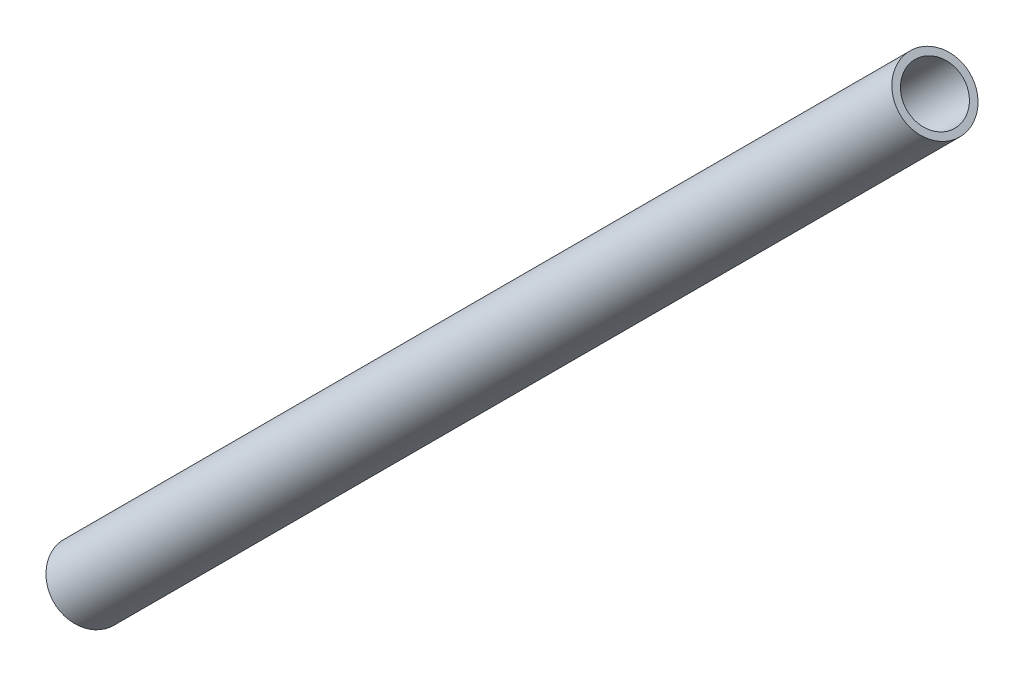
ISO-10303-21;
HEADER;
FILE_DESCRIPTION(('STEP AP214'),'2;1');
FILE_NAME('part.step','',(''),(''),'','','');
FILE_SCHEMA(('AUTOMOTIVE_DESIGN { 1 0 10303 214 1 1 1 1 }'));
ENDSEC;
DATA;
#1=APPLICATION_CONTEXT('core data for automotive mechanical design processes');
#2=APPLICATION_PROTOCOL_DEFINITION('international standard','automotive_design',2000,#1);
#3=PRODUCT_CONTEXT('',#1,'mechanical');
#4=PRODUCT('Part','Part','',(#3));
#5=PRODUCT_RELATED_PRODUCT_CATEGORY('part','',(#4));
#6=PRODUCT_DEFINITION_FORMATION('','',#4);
#7=PRODUCT_DEFINITION_CONTEXT('part definition',#1,'design');
#8=PRODUCT_DEFINITION('design','',#6,#7);
#9=PRODUCT_DEFINITION_SHAPE('','',#8);
#10=(LENGTH_UNIT() NAMED_UNIT(*) SI_UNIT(.MILLI.,.METRE.));
#11=(NAMED_UNIT(*) PLANE_ANGLE_UNIT() SI_UNIT($,.RADIAN.));
#12=(NAMED_UNIT(*) SI_UNIT($,.STERADIAN.) SOLID_ANGLE_UNIT());
#13=UNCERTAINTY_MEASURE_WITH_UNIT(LENGTH_MEASURE(1.E-05),#10,'distance_accuracy_value','');
#14=(GEOMETRIC_REPRESENTATION_CONTEXT(3) GLOBAL_UNCERTAINTY_ASSIGNED_CONTEXT((#13)) GLOBAL_UNIT_ASSIGNED_CONTEXT((#10,
#11,#12)) REPRESENTATION_CONTEXT('',''));
#15=CARTESIAN_POINT('',(0.,0.,0.));
#16=DIRECTION('',(0.,0.,1.));
#17=DIRECTION('',(1.,0.,0.));
#18=AXIS2_PLACEMENT_3D('',#15,#16,#17);
#19=CARTESIAN_POINT('',(1.84417173336933,-52.5418632261594,-9.99999999999968));
#20=DIRECTION('',(-0.707106781186544,-0.707106781186551,0.));
#21=DIRECTION('',(0.707106781186551,-0.707106781186544,0.));
#22=AXIS2_PLACEMENT_3D('',#19,#20,#21);
#23=PLANE('',#22);
#24=CARTESIAN_POINT('',(1.84417173336933,-52.5418632261594,-9.99999999999968));
#25=DIRECTION('',(-0.707106781186544,-0.707106781186551,0.));
#26=DIRECTION('',(0.707106781186551,-0.707106781186544,0.));
#27=AXIS2_PLACEMENT_3D('',#24,#25,#26);
#28=CIRCLE('',#27,5.);
#29=CARTESIAN_POINT('',(5.37970563930208,-56.0773971320922,-9.99999999999968));
#30=VERTEX_POINT('',#29);
#31=EDGE_CURVE('E10',#30,#30,#28,.T.);
#32=ORIENTED_EDGE('',*,*,#31,.T.);
#33=EDGE_LOOP('',(#32));
#34=FACE_BOUND('',#33,.T.);
#35=CARTESIAN_POINT('',(1.84417173336933,-52.5418632261594,-9.99999999999968));
#36=DIRECTION('',(-0.707106781186544,-0.707106781186551,0.));
#37=DIRECTION('',(0.707106781186551,-0.707106781186544,0.));
#38=AXIS2_PLACEMENT_3D('',#35,#36,#37);
#39=CIRCLE('',#38,3.99999999999999);
#40=CARTESIAN_POINT('',(4.67259885811553,-55.3702903509056,-9.99999999999968));
#41=VERTEX_POINT('',#40);
#42=EDGE_CURVE('E39',#41,#41,#39,.T.);
#43=ORIENTED_EDGE('',*,*,#42,.F.);
#44=EDGE_LOOP('',(#43));
#45=FACE_BOUND('',#44,.T.);
#46=ADVANCED_FACE('F28',(#34,#45),#23,.T.);
#47=CARTESIAN_POINT('',(122.052324535082,67.6662895755543,-9.99999999999967));
#48=DIRECTION('',(-0.707106781186544,-0.707106781186551,0.));
#49=DIRECTION('',(0.707106781186551,-0.707106781186544,0.));
#50=AXIS2_PLACEMENT_3D('',#47,#48,#49);
#51=PLANE('',#50);
#52=CARTESIAN_POINT('',(122.052324535082,67.6662895755543,-9.99999999999967));
#53=DIRECTION('',(-0.707106781186544,-0.707106781186551,0.));
#54=DIRECTION('',(0.707106781186551,-0.707106781186544,0.));
#55=AXIS2_PLACEMENT_3D('',#52,#53,#54);
#56=CIRCLE('',#55,5.);
#57=CARTESIAN_POINT('',(125.587858441015,64.1307556696215,-9.99999999999967));
#58=VERTEX_POINT('',#57);
#59=EDGE_CURVE('E32',#58,#58,#56,.T.);
#60=ORIENTED_EDGE('',*,*,#59,.F.);
#61=EDGE_LOOP('',(#60));
#62=FACE_BOUND('',#61,.T.);
#63=CARTESIAN_POINT('',(122.052324535082,67.6662895755543,-9.99999999999967));
#64=DIRECTION('',(-0.707106781186544,-0.707106781186551,0.));
#65=DIRECTION('',(0.707106781186551,-0.707106781186544,0.));
#66=AXIS2_PLACEMENT_3D('',#63,#64,#65);
#67=CIRCLE('',#66,3.99999999999999);
#68=CARTESIAN_POINT('',(124.880751659828,64.8378624508081,-9.99999999999967));
#69=VERTEX_POINT('',#68);
#70=EDGE_CURVE('E41',#69,#69,#67,.T.);
#71=ORIENTED_EDGE('',*,*,#70,.T.);
#72=EDGE_LOOP('',(#71));
#73=FACE_BOUND('',#72,.T.);
#74=ADVANCED_FACE('F51',(#62,#73),#51,.F.);
#75=CARTESIAN_POINT('',(1.84417173336933,-52.5418632261594,-9.99999999999968));
#76=DIRECTION('',(0.707106781186544,0.707106781186551,0.));
#77=DIRECTION('',(-0.707106781186551,0.707106781186544,0.));
#78=AXIS2_PLACEMENT_3D('',#75,#76,#77);
#79=CYLINDRICAL_SURFACE('',#78,5.);
#80=ORIENTED_EDGE('',*,*,#31,.F.);
#81=EDGE_LOOP('',(#80));
#82=FACE_BOUND('',#81,.T.);
#83=ORIENTED_EDGE('',*,*,#59,.T.);
#84=EDGE_LOOP('',(#83));
#85=FACE_BOUND('',#84,.T.);
#86=ADVANCED_FACE('F30',(#82,#85),#79,.T.);
#87=CARTESIAN_POINT('',(1.84417173336933,-52.5418632261594,-9.99999999999968));
#88=DIRECTION('',(0.707106781186544,0.707106781186551,0.));
#89=DIRECTION('',(-0.707106781186551,0.707106781186544,0.));
#90=AXIS2_PLACEMENT_3D('',#87,#88,#89);
#91=CYLINDRICAL_SURFACE('',#90,3.99999999999999);
#92=ORIENTED_EDGE('',*,*,#42,.T.);
#93=EDGE_LOOP('',(#92));
#94=FACE_BOUND('',#93,.T.);
#95=ORIENTED_EDGE('',*,*,#70,.F.);
#96=EDGE_LOOP('',(#95));
#97=FACE_BOUND('',#96,.T.);
#98=ADVANCED_FACE('F47',(#94,#97),#91,.F.);
#99=CLOSED_SHELL('',(#46,#74,#86,#98));
#100=MANIFOLD_SOLID_BREP('B2',#99);
#101=ADVANCED_BREP_SHAPE_REPRESENTATION('',(#18,#100),#14);
#102=SHAPE_DEFINITION_REPRESENTATION(#9,#101);
ENDSEC;
END-ISO-10303-21;
